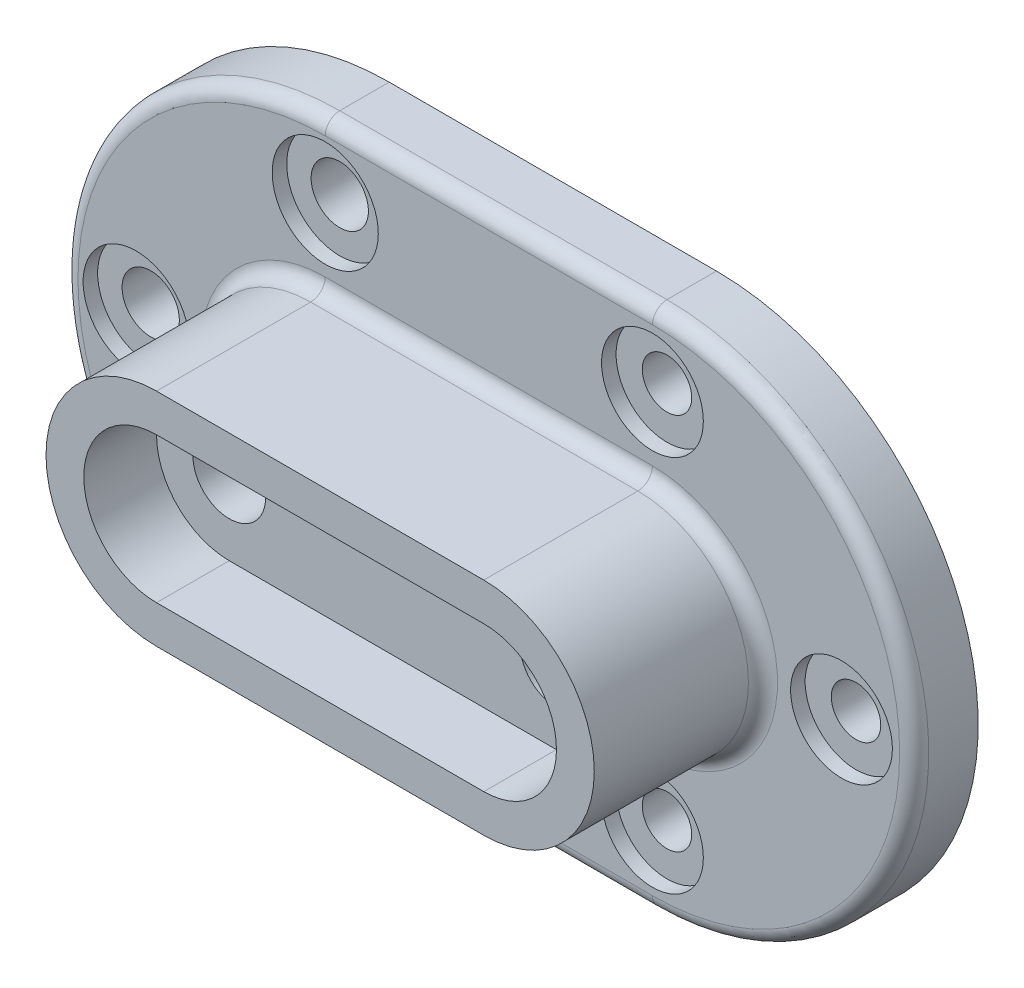
ISO-10303-21;
HEADER;
FILE_DESCRIPTION(('STEP AP214'),'2;1');
FILE_NAME('part.step','',(''),(''),'','','');
FILE_SCHEMA(('AUTOMOTIVE_DESIGN { 1 0 10303 214 1 1 1 1 }'));
ENDSEC;
DATA;
#1=APPLICATION_CONTEXT('core data for automotive mechanical design processes');
#2=APPLICATION_PROTOCOL_DEFINITION('international standard','automotive_design',2000,#1);
#3=PRODUCT_CONTEXT('',#1,'mechanical');
#4=PRODUCT('Part','Part','',(#3));
#5=PRODUCT_RELATED_PRODUCT_CATEGORY('part','',(#4));
#6=PRODUCT_DEFINITION_FORMATION('','',#4);
#7=PRODUCT_DEFINITION_CONTEXT('part definition',#1,'design');
#8=PRODUCT_DEFINITION('design','',#6,#7);
#9=PRODUCT_DEFINITION_SHAPE('','',#8);
#10=(LENGTH_UNIT() NAMED_UNIT(*) SI_UNIT(.MILLI.,.METRE.));
#11=(NAMED_UNIT(*) PLANE_ANGLE_UNIT() SI_UNIT($,.RADIAN.));
#12=(NAMED_UNIT(*) SI_UNIT($,.STERADIAN.) SOLID_ANGLE_UNIT());
#13=UNCERTAINTY_MEASURE_WITH_UNIT(LENGTH_MEASURE(1.E-05),#10,'distance_accuracy_value','');
#14=(GEOMETRIC_REPRESENTATION_CONTEXT(3) GLOBAL_UNCERTAINTY_ASSIGNED_CONTEXT((#13)) GLOBAL_UNIT_ASSIGNED_CONTEXT((#10,
#11,#12)) REPRESENTATION_CONTEXT('',''));
#15=CARTESIAN_POINT('',(0.,0.,0.));
#16=DIRECTION('',(0.,0.,1.));
#17=DIRECTION('',(1.,0.,0.));
#18=AXIS2_PLACEMENT_3D('',#15,#16,#17);
#19=CARTESIAN_POINT('',(0.,18.,4.4));
#20=DIRECTION('',(0.,1.,0.));
#21=DIRECTION('',(0.,0.,1.));
#22=AXIS2_PLACEMENT_3D('',#19,#20,#21);
#23=PLANE('',#22);
#24=DIRECTION('',(0.,0.,-1.));
#25=VECTOR('',#24,1.);
#26=CARTESIAN_POINT('',(0.,18.,4.4));
#27=LINE('',#26,#25);
#28=CARTESIAN_POINT('',(0.,18.,3.4));
#29=VERTEX_POINT('',#28);
#30=CARTESIAN_POINT('',(0.,18.,0.));
#31=VERTEX_POINT('',#30);
#32=EDGE_CURVE('E225',#29,#31,#27,.T.);
#33=ORIENTED_EDGE('',*,*,#32,.F.);
#34=DIRECTION('',(1.,0.,0.));
#35=VECTOR('',#34,1.);
#36=CARTESIAN_POINT('',(0.,18.,3.4));
#37=LINE('',#36,#35);
#38=CARTESIAN_POINT('',(22.5,18.,3.4));
#39=VERTEX_POINT('',#38);
#40=EDGE_CURVE('E261',#29,#39,#37,.T.);
#41=ORIENTED_EDGE('',*,*,#40,.T.);
#42=DIRECTION('',(0.,0.,-1.));
#43=VECTOR('',#42,1.);
#44=CARTESIAN_POINT('',(22.5,18.,4.4));
#45=LINE('',#44,#43);
#46=CARTESIAN_POINT('',(22.5,18.,0.));
#47=VERTEX_POINT('',#46);
#48=EDGE_CURVE('E216',#39,#47,#45,.T.);
#49=ORIENTED_EDGE('',*,*,#48,.T.);
#50=DIRECTION('',(1.,0.,0.));
#51=VECTOR('',#50,1.);
#52=CARTESIAN_POINT('',(0.,18.,0.));
#53=LINE('',#52,#51);
#54=EDGE_CURVE('E199',#31,#47,#53,.T.);
#55=ORIENTED_EDGE('',*,*,#54,.F.);
#56=EDGE_LOOP('',(#33,#41,#49,#55));
#57=FACE_BOUND('',#56,.T.);
#58=ADVANCED_FACE('F43',(#57),#23,.T.);
#59=CARTESIAN_POINT('',(0.,0.,4.4));
#60=DIRECTION('',(0.,0.,-1.));
#61=DIRECTION('',(-1.,0.,0.));
#62=AXIS2_PLACEMENT_3D('',#59,#60,#61);
#63=CYLINDRICAL_SURFACE('',#62,18.);
#64=DIRECTION('',(0.,0.,-1.));
#65=VECTOR('',#64,1.);
#66=CARTESIAN_POINT('',(0.,-18.,4.4));
#67=LINE('',#66,#65);
#68=CARTESIAN_POINT('',(0.,-18.,3.4));
#69=VERTEX_POINT('',#68);
#70=CARTESIAN_POINT('',(0.,-18.,0.));
#71=VERTEX_POINT('',#70);
#72=EDGE_CURVE('E222',#69,#71,#67,.T.);
#73=ORIENTED_EDGE('',*,*,#72,.F.);
#74=CARTESIAN_POINT('',(0.,0.,3.4));
#75=DIRECTION('',(0.,0.,1.));
#76=DIRECTION('',(1.,0.,0.));
#77=AXIS2_PLACEMENT_3D('',#74,#75,#76);
#78=CIRCLE('',#77,18.);
#79=EDGE_CURVE('E258',#69,#29,#78,.F.);
#80=ORIENTED_EDGE('',*,*,#79,.T.);
#81=ORIENTED_EDGE('',*,*,#32,.T.);
#82=CARTESIAN_POINT('',(0.,0.,0.));
#83=DIRECTION('',(0.,0.,1.));
#84=DIRECTION('',(1.,0.,0.));
#85=AXIS2_PLACEMENT_3D('',#82,#83,#84);
#86=CIRCLE('',#85,18.);
#87=EDGE_CURVE('E203',#31,#71,#86,.T.);
#88=ORIENTED_EDGE('',*,*,#87,.T.);
#89=EDGE_LOOP('',(#73,#80,#81,#88));
#90=FACE_BOUND('',#89,.T.);
#91=ADVANCED_FACE('F507',(#90),#63,.T.);
#92=CARTESIAN_POINT('',(0.,-18.,4.4));
#93=DIRECTION('',(0.,1.,0.));
#94=DIRECTION('',(0.,0.,1.));
#95=AXIS2_PLACEMENT_3D('',#92,#93,#94);
#96=PLANE('',#95);
#97=DIRECTION('',(0.,0.,-1.));
#98=VECTOR('',#97,1.);
#99=CARTESIAN_POINT('',(22.5,-18.,4.4));
#100=LINE('',#99,#98);
#101=CARTESIAN_POINT('',(22.5,-18.,3.4));
#102=VERTEX_POINT('',#101);
#103=CARTESIAN_POINT('',(22.5,-18.,0.));
#104=VERTEX_POINT('',#103);
#105=EDGE_CURVE('E219',#102,#104,#100,.T.);
#106=ORIENTED_EDGE('',*,*,#105,.F.);
#107=DIRECTION('',(1.,0.,0.));
#108=VECTOR('',#107,1.);
#109=CARTESIAN_POINT('',(0.,-18.,3.4));
#110=LINE('',#109,#108);
#111=EDGE_CURVE('E254',#102,#69,#110,.F.);
#112=ORIENTED_EDGE('',*,*,#111,.T.);
#113=ORIENTED_EDGE('',*,*,#72,.T.);
#114=DIRECTION('',(1.,0.,0.));
#115=VECTOR('',#114,1.);
#116=CARTESIAN_POINT('',(0.,-18.,0.));
#117=LINE('',#116,#115);
#118=EDGE_CURVE('E208',#71,#104,#117,.T.);
#119=ORIENTED_EDGE('',*,*,#118,.T.);
#120=EDGE_LOOP('',(#106,#112,#113,#119));
#121=FACE_BOUND('',#120,.T.);
#122=ADVANCED_FACE('F513',(#121),#96,.F.);
#123=CARTESIAN_POINT('',(22.5,0.,4.4));
#124=DIRECTION('',(0.,0.,-1.));
#125=DIRECTION('',(-1.,0.,0.));
#126=AXIS2_PLACEMENT_3D('',#123,#124,#125);
#127=CYLINDRICAL_SURFACE('',#126,18.);
#128=ORIENTED_EDGE('',*,*,#48,.F.);
#129=CARTESIAN_POINT('',(22.5,0.,3.4));
#130=DIRECTION('',(0.,0.,1.));
#131=DIRECTION('',(1.,0.,0.));
#132=AXIS2_PLACEMENT_3D('',#129,#130,#131);
#133=CIRCLE('',#132,18.);
#134=EDGE_CURVE('E53',#39,#102,#133,.F.);
#135=ORIENTED_EDGE('',*,*,#134,.T.);
#136=ORIENTED_EDGE('',*,*,#105,.T.);
#137=CARTESIAN_POINT('',(22.5,0.,0.));
#138=DIRECTION('',(0.,0.,1.));
#139=DIRECTION('',(1.,0.,0.));
#140=AXIS2_PLACEMENT_3D('',#137,#138,#139);
#141=CIRCLE('',#140,18.);
#142=EDGE_CURVE('E212',#104,#47,#141,.T.);
#143=ORIENTED_EDGE('',*,*,#142,.T.);
#144=EDGE_LOOP('',(#128,#135,#136,#143));
#145=FACE_BOUND('',#144,.T.);
#146=ADVANCED_FACE('F609',(#145),#127,.T.);
#147=CARTESIAN_POINT('',(0.,0.,4.4));
#148=DIRECTION('',(0.,0.,1.));
#149=DIRECTION('',(1.,0.,0.));
#150=AXIS2_PLACEMENT_3D('',#147,#148,#149);
#151=PLANE('',#150);
#152=CARTESIAN_POINT('',(0.,0.,4.4));
#153=DIRECTION('',(0.,0.,1.));
#154=DIRECTION('',(1.,0.,0.));
#155=AXIS2_PLACEMENT_3D('',#152,#153,#154);
#156=CIRCLE('',#155,17.);
#157=CARTESIAN_POINT('',(0.,17.,4.4));
#158=VERTEX_POINT('',#157);
#159=CARTESIAN_POINT('',(0.,-17.,4.4));
#160=VERTEX_POINT('',#159);
#161=EDGE_CURVE('E247',#158,#160,#156,.T.);
#162=ORIENTED_EDGE('',*,*,#161,.T.);
#163=DIRECTION('',(1.,0.,0.));
#164=VECTOR('',#163,1.);
#165=CARTESIAN_POINT('',(22.5,-17.,4.4));
#166=LINE('',#165,#164);
#167=CARTESIAN_POINT('',(22.5,-17.,4.4));
#168=VERTEX_POINT('',#167);
#169=EDGE_CURVE('E250',#160,#168,#166,.T.);
#170=ORIENTED_EDGE('',*,*,#169,.T.);
#171=CARTESIAN_POINT('',(22.5,0.,4.4));
#172=DIRECTION('',(0.,0.,1.));
#173=DIRECTION('',(1.,0.,0.));
#174=AXIS2_PLACEMENT_3D('',#171,#172,#173);
#175=CIRCLE('',#174,17.);
#176=CARTESIAN_POINT('',(22.5,17.,4.4));
#177=VERTEX_POINT('',#176);
#178=EDGE_CURVE('E241',#168,#177,#175,.T.);
#179=ORIENTED_EDGE('',*,*,#178,.T.);
#180=DIRECTION('',(1.,0.,0.));
#181=VECTOR('',#180,1.);
#182=CARTESIAN_POINT('',(0.,17.,4.4));
#183=LINE('',#182,#181);
#184=EDGE_CURVE('E244',#177,#158,#183,.F.);
#185=ORIENTED_EDGE('',*,*,#184,.T.);
#186=EDGE_LOOP('',(#162,#170,#179,#185));
#187=FACE_BOUND('',#186,.T.);
#188=DIRECTION('',(1.,0.,0.));
#189=VECTOR('',#188,1.);
#190=CARTESIAN_POINT('',(0.,-8.6,4.4));
#191=LINE('',#190,#189);
#192=CARTESIAN_POINT('',(22.5,-8.6,4.4));
#193=VERTEX_POINT('',#192);
#194=CARTESIAN_POINT('',(0.,-8.6,4.4));
#195=VERTEX_POINT('',#194);
#196=EDGE_CURVE('E228',#193,#195,#191,.F.);
#197=ORIENTED_EDGE('',*,*,#196,.T.);
#198=CARTESIAN_POINT('',(0.,0.,4.4));
#199=DIRECTION('',(0.,0.,1.));
#200=DIRECTION('',(1.,0.,0.));
#201=AXIS2_PLACEMENT_3D('',#198,#199,#200);
#202=CIRCLE('',#201,8.6);
#203=CARTESIAN_POINT('',(0.,8.6,4.4));
#204=VERTEX_POINT('',#203);
#205=EDGE_CURVE('E237',#195,#204,#202,.F.);
#206=ORIENTED_EDGE('',*,*,#205,.T.);
#207=DIRECTION('',(1.,0.,0.));
#208=VECTOR('',#207,1.);
#209=CARTESIAN_POINT('',(22.5,8.6,4.4));
#210=LINE('',#209,#208);
#211=CARTESIAN_POINT('',(22.5,8.6,4.4));
#212=VERTEX_POINT('',#211);
#213=EDGE_CURVE('E234',#204,#212,#210,.T.);
#214=ORIENTED_EDGE('',*,*,#213,.T.);
#215=CARTESIAN_POINT('',(22.5,0.,4.4));
#216=DIRECTION('',(0.,0.,1.));
#217=DIRECTION('',(1.,0.,0.));
#218=AXIS2_PLACEMENT_3D('',#215,#216,#217);
#219=CIRCLE('',#218,8.6);
#220=EDGE_CURVE('E231',#212,#193,#219,.F.);
#221=ORIENTED_EDGE('',*,*,#220,.T.);
#222=EDGE_LOOP('',(#197,#206,#214,#221));
#223=FACE_BOUND('',#222,.T.);
#224=CARTESIAN_POINT('',(35.5,0.,4.4));
#225=DIRECTION('',(0.,0.,1.));
#226=DIRECTION('',(1.,0.,0.));
#227=AXIS2_PLACEMENT_3D('',#224,#225,#226);
#228=CIRCLE('',#227,3.50000000000001);
#229=CARTESIAN_POINT('',(39.,0.,4.4));
#230=VERTEX_POINT('',#229);
#231=EDGE_CURVE('E425',#230,#230,#228,.T.);
#232=ORIENTED_EDGE('',*,*,#231,.F.);
#233=EDGE_LOOP('',(#232));
#234=FACE_BOUND('',#233,.T.);
#235=CARTESIAN_POINT('',(-1.37759813053774E-13,-13.,4.4));
#236=DIRECTION('',(0.,0.,1.));
#237=DIRECTION('',(1.,0.,0.));
#238=AXIS2_PLACEMENT_3D('',#235,#236,#237);
#239=CIRCLE('',#238,3.64892559210427);
#240=CARTESIAN_POINT('',(3.64892559210413,-13.,4.4));
#241=VERTEX_POINT('',#240);
#242=EDGE_CURVE('E426',#241,#241,#239,.T.);
#243=ORIENTED_EDGE('',*,*,#242,.F.);
#244=EDGE_LOOP('',(#243));
#245=FACE_BOUND('',#244,.T.);
#246=CARTESIAN_POINT('',(22.5000000000001,13.,4.4));
#247=DIRECTION('',(0.,0.,1.));
#248=DIRECTION('',(1.,0.,0.));
#249=AXIS2_PLACEMENT_3D('',#246,#247,#248);
#250=CIRCLE('',#249,3.50000000000001);
#251=CARTESIAN_POINT('',(26.0000000000001,13.,4.4));
#252=VERTEX_POINT('',#251);
#253=EDGE_CURVE('E392',#252,#252,#250,.T.);
#254=ORIENTED_EDGE('',*,*,#253,.F.);
#255=EDGE_LOOP('',(#254));
#256=FACE_BOUND('',#255,.T.);
#257=CARTESIAN_POINT('',(0.,13.,4.4));
#258=DIRECTION('',(0.,0.,1.));
#259=DIRECTION('',(1.,0.,0.));
#260=AXIS2_PLACEMENT_3D('',#257,#258,#259);
#261=CIRCLE('',#260,3.64892559210427);
#262=CARTESIAN_POINT('',(3.64892559210431,13.,4.4));
#263=VERTEX_POINT('',#262);
#264=EDGE_CURVE('E401',#263,#263,#261,.T.);
#265=ORIENTED_EDGE('',*,*,#264,.F.);
#266=EDGE_LOOP('',(#265));
#267=FACE_BOUND('',#266,.T.);
#268=CARTESIAN_POINT('',(22.5,-13.,4.4));
#269=DIRECTION('',(0.,0.,1.));
#270=DIRECTION('',(1.,0.,0.));
#271=AXIS2_PLACEMENT_3D('',#268,#269,#270);
#272=CIRCLE('',#271,3.50000000000001);
#273=CARTESIAN_POINT('',(26.,-13.,4.4));
#274=VERTEX_POINT('',#273);
#275=EDGE_CURVE('E409',#274,#274,#272,.T.);
#276=ORIENTED_EDGE('',*,*,#275,.F.);
#277=EDGE_LOOP('',(#276));
#278=FACE_BOUND('',#277,.T.);
#279=CARTESIAN_POINT('',(-13.,0.,4.4));
#280=DIRECTION('',(0.,0.,1.));
#281=DIRECTION('',(1.,0.,0.));
#282=AXIS2_PLACEMENT_3D('',#279,#280,#281);
#283=CIRCLE('',#282,3.64892559210427);
#284=CARTESIAN_POINT('',(-9.35107440789573,0.,4.4));
#285=VERTEX_POINT('',#284);
#286=EDGE_CURVE('E417',#285,#285,#283,.T.);
#287=ORIENTED_EDGE('',*,*,#286,.F.);
#288=EDGE_LOOP('',(#287));
#289=FACE_BOUND('',#288,.T.);
#290=ADVANCED_FACE('F312',(#187,#223,#234,#245,#256,#267,#278,#289),#151,.T.);
#291=CARTESIAN_POINT('',(0.,0.,0.));
#292=DIRECTION('',(0.,0.,1.));
#293=DIRECTION('',(1.,0.,0.));
#294=AXIS2_PLACEMENT_3D('',#291,#292,#293);
#295=PLANE('',#294);
#296=CARTESIAN_POINT('',(-13.,0.,0.));
#297=DIRECTION('',(0.,0.,1.));
#298=DIRECTION('',(1.,0.,0.));
#299=AXIS2_PLACEMENT_3D('',#296,#297,#298);
#300=CIRCLE('',#299,1.97040033987221);
#301=CARTESIAN_POINT('',(-11.0295996601278,0.,0.));
#302=VERTEX_POINT('',#301);
#303=EDGE_CURVE('E463',#302,#302,#300,.T.);
#304=ORIENTED_EDGE('',*,*,#303,.T.);
#305=EDGE_LOOP('',(#304));
#306=FACE_BOUND('',#305,.T.);
#307=CARTESIAN_POINT('',(22.5,-13.,0.));
#308=DIRECTION('',(0.,0.,1.));
#309=DIRECTION('',(1.,0.,0.));
#310=AXIS2_PLACEMENT_3D('',#307,#308,#309);
#311=CIRCLE('',#310,1.7);
#312=CARTESIAN_POINT('',(24.1999999999999,-13.,0.));
#313=VERTEX_POINT('',#312);
#314=EDGE_CURVE('E289',#313,#313,#311,.T.);
#315=ORIENTED_EDGE('',*,*,#314,.T.);
#316=EDGE_LOOP('',(#315));
#317=FACE_BOUND('',#316,.T.);
#318=CARTESIAN_POINT('',(22.5000000000001,13.,0.));
#319=DIRECTION('',(0.,0.,1.));
#320=DIRECTION('',(1.,0.,0.));
#321=AXIS2_PLACEMENT_3D('',#318,#319,#320);
#322=CIRCLE('',#321,1.7);
#323=CARTESIAN_POINT('',(24.2000000000001,13.,0.));
#324=VERTEX_POINT('',#323);
#325=EDGE_CURVE('E464',#324,#324,#322,.T.);
#326=ORIENTED_EDGE('',*,*,#325,.T.);
#327=EDGE_LOOP('',(#326));
#328=FACE_BOUND('',#327,.T.);
#329=CARTESIAN_POINT('',(35.5,0.,0.));
#330=DIRECTION('',(0.,0.,1.));
#331=DIRECTION('',(1.,0.,0.));
#332=AXIS2_PLACEMENT_3D('',#329,#330,#331);
#333=CIRCLE('',#332,1.7);
#334=CARTESIAN_POINT('',(37.2,0.,0.));
#335=VERTEX_POINT('',#334);
#336=EDGE_CURVE('E468',#335,#335,#333,.T.);
#337=ORIENTED_EDGE('',*,*,#336,.T.);
#338=EDGE_LOOP('',(#337));
#339=FACE_BOUND('',#338,.T.);
#340=CARTESIAN_POINT('',(-1.37759813053774E-13,-13.,0.));
#341=DIRECTION('',(0.,0.,1.));
#342=DIRECTION('',(1.,0.,0.));
#343=AXIS2_PLACEMENT_3D('',#340,#341,#342);
#344=CIRCLE('',#343,1.97040033987221);
#345=CARTESIAN_POINT('',(1.97040033987207,-13.,0.));
#346=VERTEX_POINT('',#345);
#347=EDGE_CURVE('E472',#346,#346,#344,.T.);
#348=ORIENTED_EDGE('',*,*,#347,.T.);
#349=EDGE_LOOP('',(#348));
#350=FACE_BOUND('',#349,.T.);
#351=CARTESIAN_POINT('',(0.,13.,0.));
#352=DIRECTION('',(0.,0.,1.));
#353=DIRECTION('',(1.,0.,0.));
#354=AXIS2_PLACEMENT_3D('',#351,#352,#353);
#355=CIRCLE('',#354,1.97040033987221);
#356=CARTESIAN_POINT('',(1.97040033987226,13.,0.));
#357=VERTEX_POINT('',#356);
#358=EDGE_CURVE('E476',#357,#357,#355,.T.);
#359=ORIENTED_EDGE('',*,*,#358,.T.);
#360=EDGE_LOOP('',(#359));
#361=FACE_BOUND('',#360,.T.);
#362=CARTESIAN_POINT('',(0.,0.,0.));
#363=DIRECTION('',(0.,0.,1.));
#364=DIRECTION('',(1.,0.,0.));
#365=AXIS2_PLACEMENT_3D('',#362,#363,#364);
#366=CIRCLE('',#365,2.5);
#367=CARTESIAN_POINT('',(2.5,0.,0.));
#368=VERTEX_POINT('',#367);
#369=EDGE_CURVE('E170',#368,#368,#366,.T.);
#370=ORIENTED_EDGE('',*,*,#369,.T.);
#371=EDGE_LOOP('',(#370));
#372=FACE_BOUND('',#371,.T.);
#373=CARTESIAN_POINT('',(22.5,0.,0.));
#374=DIRECTION('',(0.,0.,1.));
#375=DIRECTION('',(1.,0.,0.));
#376=AXIS2_PLACEMENT_3D('',#373,#374,#375);
#377=CIRCLE('',#376,2.5);
#378=CARTESIAN_POINT('',(25.,0.,0.));
#379=VERTEX_POINT('',#378);
#380=EDGE_CURVE('E380',#379,#379,#377,.T.);
#381=ORIENTED_EDGE('',*,*,#380,.T.);
#382=EDGE_LOOP('',(#381));
#383=FACE_BOUND('',#382,.T.);
#384=ORIENTED_EDGE('',*,*,#54,.T.);
#385=ORIENTED_EDGE('',*,*,#142,.F.);
#386=ORIENTED_EDGE('',*,*,#118,.F.);
#387=ORIENTED_EDGE('',*,*,#87,.F.);
#388=EDGE_LOOP('',(#384,#385,#386,#387));
#389=FACE_BOUND('',#388,.T.);
#390=ADVANCED_FACE('F487',(#306,#317,#328,#339,#350,#361,#372,#383,#389),#295,.F.);
#391=CARTESIAN_POINT('',(0.,-7.6,16.));
#392=DIRECTION('',(0.,1.,0.));
#393=DIRECTION('',(0.,0.,1.));
#394=AXIS2_PLACEMENT_3D('',#391,#392,#393);
#395=PLANE('',#394);
#396=DIRECTION('',(0.,0.,-1.));
#397=VECTOR('',#396,1.);
#398=CARTESIAN_POINT('',(0.,-7.6,16.));
#399=LINE('',#398,#397);
#400=CARTESIAN_POINT('',(0.,-7.6,16.));
#401=VERTEX_POINT('',#400);
#402=CARTESIAN_POINT('',(0.,-7.6,5.4));
#403=VERTEX_POINT('',#402);
#404=EDGE_CURVE('E188',#401,#403,#399,.T.);
#405=ORIENTED_EDGE('',*,*,#404,.T.);
#406=DIRECTION('',(1.,0.,0.));
#407=VECTOR('',#406,1.);
#408=CARTESIAN_POINT('',(0.,-7.6,5.4));
#409=LINE('',#408,#407);
#410=CARTESIAN_POINT('',(22.5,-7.6,5.4));
#411=VERTEX_POINT('',#410);
#412=EDGE_CURVE('E11',#403,#411,#409,.T.);
#413=ORIENTED_EDGE('',*,*,#412,.T.);
#414=DIRECTION('',(0.,0.,-1.));
#415=VECTOR('',#414,1.);
#416=CARTESIAN_POINT('',(22.5,-7.6,16.));
#417=LINE('',#416,#415);
#418=CARTESIAN_POINT('',(22.5,-7.6,16.));
#419=VERTEX_POINT('',#418);
#420=EDGE_CURVE('E204',#419,#411,#417,.T.);
#421=ORIENTED_EDGE('',*,*,#420,.F.);
#422=DIRECTION('',(1.,0.,0.));
#423=VECTOR('',#422,1.);
#424=CARTESIAN_POINT('',(0.,-7.6,16.));
#425=LINE('',#424,#423);
#426=EDGE_CURVE('E328',#401,#419,#425,.T.);
#427=ORIENTED_EDGE('',*,*,#426,.F.);
#428=EDGE_LOOP('',(#405,#413,#421,#427));
#429=FACE_BOUND('',#428,.T.);
#430=ADVANCED_FACE('F326',(#429),#395,.F.);
#431=CARTESIAN_POINT('',(22.5,0.,16.));
#432=DIRECTION('',(0.,0.,-1.));
#433=DIRECTION('',(-1.,0.,0.));
#434=AXIS2_PLACEMENT_3D('',#431,#432,#433);
#435=CYLINDRICAL_SURFACE('',#434,7.6);
#436=ORIENTED_EDGE('',*,*,#420,.T.);
#437=CARTESIAN_POINT('',(22.5,0.,5.4));
#438=DIRECTION('',(0.,0.,1.));
#439=DIRECTION('',(1.,0.,0.));
#440=AXIS2_PLACEMENT_3D('',#437,#438,#439);
#441=CIRCLE('',#440,7.6);
#442=CARTESIAN_POINT('',(22.5,7.6,5.4));
#443=VERTEX_POINT('',#442);
#444=EDGE_CURVE('E66',#411,#443,#441,.T.);
#445=ORIENTED_EDGE('',*,*,#444,.T.);
#446=DIRECTION('',(0.,0.,-1.));
#447=VECTOR('',#446,1.);
#448=CARTESIAN_POINT('',(22.5,7.6,16.));
#449=LINE('',#448,#447);
#450=CARTESIAN_POINT('',(22.5,7.6,16.));
#451=VERTEX_POINT('',#450);
#452=EDGE_CURVE('E350',#451,#443,#449,.T.);
#453=ORIENTED_EDGE('',*,*,#452,.F.);
#454=CARTESIAN_POINT('',(22.5,0.,16.));
#455=DIRECTION('',(0.,0.,1.));
#456=DIRECTION('',(1.,0.,0.));
#457=AXIS2_PLACEMENT_3D('',#454,#455,#456);
#458=CIRCLE('',#457,7.6);
#459=EDGE_CURVE('E331',#419,#451,#458,.T.);
#460=ORIENTED_EDGE('',*,*,#459,.F.);
#461=EDGE_LOOP('',(#436,#445,#453,#460));
#462=FACE_BOUND('',#461,.T.);
#463=ADVANCED_FACE('F579',(#462),#435,.T.);
#464=CARTESIAN_POINT('',(0.,7.6,16.));
#465=DIRECTION('',(0.,1.,0.));
#466=DIRECTION('',(-1.,0.,0.));
#467=AXIS2_PLACEMENT_3D('',#464,#465,#466);
#468=PLANE('',#467);
#469=ORIENTED_EDGE('',*,*,#452,.T.);
#470=DIRECTION('',(1.,0.,0.));
#471=VECTOR('',#470,1.);
#472=CARTESIAN_POINT('',(0.,7.6,5.4));
#473=LINE('',#472,#471);
#474=CARTESIAN_POINT('',(0.,7.6,5.4));
#475=VERTEX_POINT('',#474);
#476=EDGE_CURVE('E268',#443,#475,#473,.F.);
#477=ORIENTED_EDGE('',*,*,#476,.T.);
#478=DIRECTION('',(0.,0.,-1.));
#479=VECTOR('',#478,1.);
#480=CARTESIAN_POINT('',(0.,7.6,16.));
#481=LINE('',#480,#479);
#482=CARTESIAN_POINT('',(0.,7.6,16.));
#483=VERTEX_POINT('',#482);
#484=EDGE_CURVE('E193',#483,#475,#481,.T.);
#485=ORIENTED_EDGE('',*,*,#484,.F.);
#486=DIRECTION('',(1.,0.,0.));
#487=VECTOR('',#486,1.);
#488=CARTESIAN_POINT('',(0.,7.6,16.));
#489=LINE('',#488,#487);
#490=EDGE_CURVE('E336',#483,#451,#489,.T.);
#491=ORIENTED_EDGE('',*,*,#490,.T.);
#492=EDGE_LOOP('',(#469,#477,#485,#491));
#493=FACE_BOUND('',#492,.T.);
#494=ADVANCED_FACE('F574',(#493),#468,.T.);
#495=CARTESIAN_POINT('',(22.5,0.,16.));
#496=DIRECTION('',(0.,0.,-1.));
#497=DIRECTION('',(-1.,0.,0.));
#498=AXIS2_PLACEMENT_3D('',#495,#496,#497);
#499=CYLINDRICAL_SURFACE('',#498,5.);
#500=CARTESIAN_POINT('',(22.5,0.,11.));
#501=DIRECTION('',(0.,0.,1.));
#502=DIRECTION('',(1.,0.,0.));
#503=AXIS2_PLACEMENT_3D('',#500,#501,#502);
#504=CIRCLE('',#503,5.);
#505=CARTESIAN_POINT('',(22.5,-5.,11.));
#506=VERTEX_POINT('',#505);
#507=CARTESIAN_POINT('',(22.5,5.,11.));
#508=VERTEX_POINT('',#507);
#509=EDGE_CURVE('E162',#506,#508,#504,.T.);
#510=ORIENTED_EDGE('',*,*,#509,.F.);
#511=DIRECTION('',(0.,0.,-1.));
#512=VECTOR('',#511,1.);
#513=CARTESIAN_POINT('',(22.5,-5.,16.));
#514=LINE('',#513,#512);
#515=CARTESIAN_POINT('',(22.5,-5.,16.));
#516=VERTEX_POINT('',#515);
#517=EDGE_CURVE('E176',#516,#506,#514,.T.);
#518=ORIENTED_EDGE('',*,*,#517,.F.);
#519=CARTESIAN_POINT('',(22.5,0.,16.));
#520=DIRECTION('',(0.,0.,1.));
#521=DIRECTION('',(1.,0.,0.));
#522=AXIS2_PLACEMENT_3D('',#519,#520,#521);
#523=CIRCLE('',#522,5.);
#524=CARTESIAN_POINT('',(22.5,5.,16.));
#525=VERTEX_POINT('',#524);
#526=EDGE_CURVE('E366',#516,#525,#523,.T.);
#527=ORIENTED_EDGE('',*,*,#526,.T.);
#528=DIRECTION('',(0.,0.,-1.));
#529=VECTOR('',#528,1.);
#530=CARTESIAN_POINT('',(22.5,5.,16.));
#531=LINE('',#530,#529);
#532=EDGE_CURVE('E179',#525,#508,#531,.T.);
#533=ORIENTED_EDGE('',*,*,#532,.T.);
#534=EDGE_LOOP('',(#510,#518,#527,#533));
#535=FACE_BOUND('',#534,.T.);
#536=ADVANCED_FACE('F174',(#535),#499,.F.);
#537=CARTESIAN_POINT('',(0.,-5.,16.));
#538=DIRECTION('',(0.,1.,0.));
#539=DIRECTION('',(0.,0.,1.));
#540=AXIS2_PLACEMENT_3D('',#537,#538,#539);
#541=PLANE('',#540);
#542=DIRECTION('',(1.,0.,0.));
#543=VECTOR('',#542,1.);
#544=CARTESIAN_POINT('',(0.,-5.,11.));
#545=LINE('',#544,#543);
#546=CARTESIAN_POINT('',(0.,-5.,11.));
#547=VERTEX_POINT('',#546);
#548=EDGE_CURVE('E159',#547,#506,#545,.T.);
#549=ORIENTED_EDGE('',*,*,#548,.F.);
#550=DIRECTION('',(0.,0.,-1.));
#551=VECTOR('',#550,1.);
#552=CARTESIAN_POINT('',(0.,-5.,16.));
#553=LINE('',#552,#551);
#554=CARTESIAN_POINT('',(0.,-5.,16.));
#555=VERTEX_POINT('',#554);
#556=EDGE_CURVE('E189',#555,#547,#553,.T.);
#557=ORIENTED_EDGE('',*,*,#556,.F.);
#558=DIRECTION('',(1.,0.,0.));
#559=VECTOR('',#558,1.);
#560=CARTESIAN_POINT('',(0.,-5.,16.));
#561=LINE('',#560,#559);
#562=EDGE_CURVE('E186',#555,#516,#561,.T.);
#563=ORIENTED_EDGE('',*,*,#562,.T.);
#564=ORIENTED_EDGE('',*,*,#517,.T.);
#565=EDGE_LOOP('',(#549,#557,#563,#564));
#566=FACE_BOUND('',#565,.T.);
#567=ADVANCED_FACE('F184',(#566),#541,.T.);
#568=CARTESIAN_POINT('',(0.,0.,16.));
#569=DIRECTION('',(0.,0.,-1.));
#570=DIRECTION('',(-1.,0.,0.));
#571=AXIS2_PLACEMENT_3D('',#568,#569,#570);
#572=CYLINDRICAL_SURFACE('',#571,5.);
#573=CARTESIAN_POINT('',(0.,0.,11.));
#574=DIRECTION('',(0.,0.,1.));
#575=DIRECTION('',(1.,0.,0.));
#576=AXIS2_PLACEMENT_3D('',#573,#574,#575);
#577=CIRCLE('',#576,5.);
#578=CARTESIAN_POINT('',(0.,5.,11.));
#579=VERTEX_POINT('',#578);
#580=EDGE_CURVE('E165',#579,#547,#577,.T.);
#581=ORIENTED_EDGE('',*,*,#580,.F.);
#582=DIRECTION('',(0.,0.,-1.));
#583=VECTOR('',#582,1.);
#584=CARTESIAN_POINT('',(0.,5.,16.));
#585=LINE('',#584,#583);
#586=CARTESIAN_POINT('',(0.,5.,16.));
#587=VERTEX_POINT('',#586);
#588=EDGE_CURVE('E195',#587,#579,#585,.T.);
#589=ORIENTED_EDGE('',*,*,#588,.F.);
#590=CARTESIAN_POINT('',(0.,0.,16.));
#591=DIRECTION('',(0.,0.,1.));
#592=DIRECTION('',(1.,0.,0.));
#593=AXIS2_PLACEMENT_3D('',#590,#591,#592);
#594=CIRCLE('',#593,5.);
#595=EDGE_CURVE('E338',#587,#555,#594,.T.);
#596=ORIENTED_EDGE('',*,*,#595,.T.);
#597=ORIENTED_EDGE('',*,*,#556,.T.);
#598=EDGE_LOOP('',(#581,#589,#596,#597));
#599=FACE_BOUND('',#598,.T.);
#600=ADVANCED_FACE('F364',(#599),#572,.F.);
#601=CARTESIAN_POINT('',(0.,5.,16.));
#602=DIRECTION('',(0.,1.,0.));
#603=DIRECTION('',(-1.,0.,0.));
#604=AXIS2_PLACEMENT_3D('',#601,#602,#603);
#605=PLANE('',#604);
#606=ORIENTED_EDGE('',*,*,#588,.T.);
#607=DIRECTION('',(1.,0.,0.));
#608=VECTOR('',#607,1.);
#609=CARTESIAN_POINT('',(0.,5.,11.));
#610=LINE('',#609,#608);
#611=EDGE_CURVE('E181',#579,#508,#610,.T.);
#612=ORIENTED_EDGE('',*,*,#611,.T.);
#613=ORIENTED_EDGE('',*,*,#532,.F.);
#614=DIRECTION('',(1.,0.,0.));
#615=VECTOR('',#614,1.);
#616=CARTESIAN_POINT('',(0.,5.,16.));
#617=LINE('',#616,#615);
#618=EDGE_CURVE('E332',#587,#525,#617,.T.);
#619=ORIENTED_EDGE('',*,*,#618,.F.);
#620=EDGE_LOOP('',(#606,#612,#613,#619));
#621=FACE_BOUND('',#620,.T.);
#622=ADVANCED_FACE('F360',(#621),#605,.F.);
#623=CARTESIAN_POINT('',(0.,0.,16.));
#624=DIRECTION('',(0.,0.,-1.));
#625=DIRECTION('',(-1.,0.,0.));
#626=AXIS2_PLACEMENT_3D('',#623,#624,#625);
#627=CYLINDRICAL_SURFACE('',#626,7.6);
#628=ORIENTED_EDGE('',*,*,#484,.T.);
#629=CARTESIAN_POINT('',(0.,0.,5.4));
#630=DIRECTION('',(0.,0.,1.));
#631=DIRECTION('',(1.,0.,0.));
#632=AXIS2_PLACEMENT_3D('',#629,#630,#631);
#633=CIRCLE('',#632,7.6);
#634=EDGE_CURVE('E264',#475,#403,#633,.T.);
#635=ORIENTED_EDGE('',*,*,#634,.T.);
#636=ORIENTED_EDGE('',*,*,#404,.F.);
#637=CARTESIAN_POINT('',(0.,0.,16.));
#638=DIRECTION('',(0.,0.,1.));
#639=DIRECTION('',(1.,0.,0.));
#640=AXIS2_PLACEMENT_3D('',#637,#638,#639);
#641=CIRCLE('',#640,7.6);
#642=EDGE_CURVE('E345',#483,#401,#641,.T.);
#643=ORIENTED_EDGE('',*,*,#642,.F.);
#644=EDGE_LOOP('',(#628,#635,#636,#643));
#645=FACE_BOUND('',#644,.T.);
#646=ADVANCED_FACE('F323',(#645),#627,.T.);
#647=CARTESIAN_POINT('',(0.,0.,16.));
#648=DIRECTION('',(0.,0.,1.));
#649=DIRECTION('',(1.,0.,0.));
#650=AXIS2_PLACEMENT_3D('',#647,#648,#649);
#651=PLANE('',#650);
#652=ORIENTED_EDGE('',*,*,#526,.F.);
#653=ORIENTED_EDGE('',*,*,#562,.F.);
#654=ORIENTED_EDGE('',*,*,#595,.F.);
#655=ORIENTED_EDGE('',*,*,#618,.T.);
#656=EDGE_LOOP('',(#652,#653,#654,#655));
#657=FACE_BOUND('',#656,.T.);
#658=ORIENTED_EDGE('',*,*,#426,.T.);
#659=ORIENTED_EDGE('',*,*,#459,.T.);
#660=ORIENTED_EDGE('',*,*,#490,.F.);
#661=ORIENTED_EDGE('',*,*,#642,.T.);
#662=EDGE_LOOP('',(#658,#659,#660,#661));
#663=FACE_BOUND('',#662,.T.);
#664=ADVANCED_FACE('F565',(#657,#663),#651,.T.);
#665=CARTESIAN_POINT('',(0.,0.,11.));
#666=DIRECTION('',(0.,0.,1.));
#667=DIRECTION('',(1.,0.,0.));
#668=AXIS2_PLACEMENT_3D('',#665,#666,#667);
#669=PLANE('',#668);
#670=CARTESIAN_POINT('',(0.,0.,11.));
#671=DIRECTION('',(0.,0.,1.));
#672=DIRECTION('',(1.,0.,0.));
#673=AXIS2_PLACEMENT_3D('',#670,#671,#672);
#674=CIRCLE('',#673,2.5);
#675=CARTESIAN_POINT('',(2.5,0.,11.));
#676=VERTEX_POINT('',#675);
#677=EDGE_CURVE('E385',#676,#676,#674,.T.);
#678=ORIENTED_EDGE('',*,*,#677,.F.);
#679=EDGE_LOOP('',(#678));
#680=FACE_BOUND('',#679,.T.);
#681=CARTESIAN_POINT('',(22.5,0.,11.));
#682=DIRECTION('',(0.,0.,1.));
#683=DIRECTION('',(1.,0.,0.));
#684=AXIS2_PLACEMENT_3D('',#681,#682,#683);
#685=CIRCLE('',#684,2.5);
#686=CARTESIAN_POINT('',(25.,0.,11.));
#687=VERTEX_POINT('',#686);
#688=EDGE_CURVE('E376',#687,#687,#685,.T.);
#689=ORIENTED_EDGE('',*,*,#688,.F.);
#690=EDGE_LOOP('',(#689));
#691=FACE_BOUND('',#690,.T.);
#692=ORIENTED_EDGE('',*,*,#548,.T.);
#693=ORIENTED_EDGE('',*,*,#509,.T.);
#694=ORIENTED_EDGE('',*,*,#611,.F.);
#695=ORIENTED_EDGE('',*,*,#580,.T.);
#696=EDGE_LOOP('',(#692,#693,#694,#695));
#697=FACE_BOUND('',#696,.T.);
#698=ADVANCED_FACE('F161',(#680,#691,#697),#669,.T.);
#699=CARTESIAN_POINT('',(22.5,0.,0.));
#700=DIRECTION('',(0.,0.,1.));
#701=DIRECTION('',(1.,0.,0.));
#702=AXIS2_PLACEMENT_3D('',#699,#700,#701);
#703=CYLINDRICAL_SURFACE('',#702,2.5);
#704=ORIENTED_EDGE('',*,*,#380,.F.);
#705=EDGE_LOOP('',(#704));
#706=FACE_BOUND('',#705,.T.);
#707=ORIENTED_EDGE('',*,*,#688,.T.);
#708=EDGE_LOOP('',(#707));
#709=FACE_BOUND('',#708,.T.);
#710=ADVANCED_FACE('F824',(#706,#709),#703,.F.);
#711=CARTESIAN_POINT('',(0.,0.,0.));
#712=DIRECTION('',(0.,0.,1.));
#713=DIRECTION('',(1.,0.,0.));
#714=AXIS2_PLACEMENT_3D('',#711,#712,#713);
#715=CYLINDRICAL_SURFACE('',#714,2.5);
#716=ORIENTED_EDGE('',*,*,#369,.F.);
#717=EDGE_LOOP('',(#716));
#718=FACE_BOUND('',#717,.T.);
#719=ORIENTED_EDGE('',*,*,#677,.T.);
#720=EDGE_LOOP('',(#719));
#721=FACE_BOUND('',#720,.T.);
#722=ADVANCED_FACE('F814',(#718,#721),#715,.F.);
#723=CARTESIAN_POINT('',(-13.,0.,3.4));
#724=DIRECTION('',(0.,0.,1.));
#725=DIRECTION('',(1.,0.,0.));
#726=AXIS2_PLACEMENT_3D('',#723,#724,#725);
#727=CYLINDRICAL_SURFACE('',#726,3.64892559210427);
#728=CARTESIAN_POINT('',(-13.,0.,3.4));
#729=DIRECTION('',(0.,0.,1.));
#730=DIRECTION('',(1.,0.,0.));
#731=AXIS2_PLACEMENT_3D('',#728,#729,#730);
#732=CIRCLE('',#731,3.64892559210427);
#733=CARTESIAN_POINT('',(-9.35107440789573,0.,3.4));
#734=VERTEX_POINT('',#733);
#735=EDGE_CURVE('E421',#734,#734,#732,.T.);
#736=ORIENTED_EDGE('',*,*,#735,.F.);
#737=EDGE_LOOP('',(#736));
#738=FACE_BOUND('',#737,.T.);
#739=ORIENTED_EDGE('',*,*,#286,.T.);
#740=EDGE_LOOP('',(#739));
#741=FACE_BOUND('',#740,.T.);
#742=ADVANCED_FACE('F804',(#738,#741),#727,.F.);
#743=CARTESIAN_POINT('',(-13.,0.,3.4));
#744=DIRECTION('',(0.,0.,1.));
#745=DIRECTION('',(1.,0.,0.));
#746=AXIS2_PLACEMENT_3D('',#743,#744,#745);
#747=PLANE('',#746);
#748=CARTESIAN_POINT('',(-13.,0.,3.4));
#749=DIRECTION('',(0.,0.,1.));
#750=DIRECTION('',(1.,0.,0.));
#751=AXIS2_PLACEMENT_3D('',#748,#749,#750);
#752=CIRCLE('',#751,1.97040033987221);
#753=CARTESIAN_POINT('',(-11.0295996601278,0.,3.4));
#754=VERTEX_POINT('',#753);
#755=EDGE_CURVE('E430',#754,#754,#752,.T.);
#756=ORIENTED_EDGE('',*,*,#755,.F.);
#757=EDGE_LOOP('',(#756));
#758=FACE_BOUND('',#757,.T.);
#759=ORIENTED_EDGE('',*,*,#735,.T.);
#760=EDGE_LOOP('',(#759));
#761=FACE_BOUND('',#760,.T.);
#762=ADVANCED_FACE('F794',(#758,#761),#747,.T.);
#763=CARTESIAN_POINT('',(22.5,-13.,3.4));
#764=DIRECTION('',(0.,0.,1.));
#765=DIRECTION('',(1.,0.,0.));
#766=AXIS2_PLACEMENT_3D('',#763,#764,#765);
#767=CYLINDRICAL_SURFACE('',#766,3.50000000000001);
#768=CARTESIAN_POINT('',(22.5,-13.,3.4));
#769=DIRECTION('',(0.,0.,1.));
#770=DIRECTION('',(1.,0.,0.));
#771=AXIS2_PLACEMENT_3D('',#768,#769,#770);
#772=CIRCLE('',#771,3.50000000000001);
#773=CARTESIAN_POINT('',(26.,-13.,3.4));
#774=VERTEX_POINT('',#773);
#775=EDGE_CURVE('E413',#774,#774,#772,.T.);
#776=ORIENTED_EDGE('',*,*,#775,.F.);
#777=EDGE_LOOP('',(#776));
#778=FACE_BOUND('',#777,.T.);
#779=ORIENTED_EDGE('',*,*,#275,.T.);
#780=EDGE_LOOP('',(#779));
#781=FACE_BOUND('',#780,.T.);
#782=ADVANCED_FACE('F784',(#778,#781),#767,.F.);
#783=CARTESIAN_POINT('',(22.5,-13.,3.4));
#784=DIRECTION('',(0.,0.,1.));
#785=DIRECTION('',(1.,0.,0.));
#786=AXIS2_PLACEMENT_3D('',#783,#784,#785);
#787=PLANE('',#786);
#788=CARTESIAN_POINT('',(22.5,-13.,3.4));
#789=DIRECTION('',(0.,0.,1.));
#790=DIRECTION('',(1.,0.,0.));
#791=AXIS2_PLACEMENT_3D('',#788,#789,#790);
#792=CIRCLE('',#791,1.7);
#793=CARTESIAN_POINT('',(24.1999999999999,-13.,3.4));
#794=VERTEX_POINT('',#793);
#795=EDGE_CURVE('E443',#794,#794,#792,.T.);
#796=ORIENTED_EDGE('',*,*,#795,.F.);
#797=EDGE_LOOP('',(#796));
#798=FACE_BOUND('',#797,.T.);
#799=ORIENTED_EDGE('',*,*,#775,.T.);
#800=EDGE_LOOP('',(#799));
#801=FACE_BOUND('',#800,.T.);
#802=ADVANCED_FACE('F774',(#798,#801),#787,.T.);
#803=CARTESIAN_POINT('',(0.,13.,3.4));
#804=DIRECTION('',(0.,0.,1.));
#805=DIRECTION('',(1.,0.,0.));
#806=AXIS2_PLACEMENT_3D('',#803,#804,#805);
#807=CYLINDRICAL_SURFACE('',#806,3.64892559210427);
#808=CARTESIAN_POINT('',(0.,13.,3.4));
#809=DIRECTION('',(0.,0.,1.));
#810=DIRECTION('',(1.,0.,0.));
#811=AXIS2_PLACEMENT_3D('',#808,#809,#810);
#812=CIRCLE('',#811,3.64892559210427);
#813=CARTESIAN_POINT('',(3.64892559210431,13.,3.4));
#814=VERTEX_POINT('',#813);
#815=EDGE_CURVE('E405',#814,#814,#812,.T.);
#816=ORIENTED_EDGE('',*,*,#815,.F.);
#817=EDGE_LOOP('',(#816));
#818=FACE_BOUND('',#817,.T.);
#819=ORIENTED_EDGE('',*,*,#264,.T.);
#820=EDGE_LOOP('',(#819));
#821=FACE_BOUND('',#820,.T.);
#822=ADVANCED_FACE('F764',(#818,#821),#807,.F.);
#823=CARTESIAN_POINT('',(0.,13.,3.4));
#824=DIRECTION('',(0.,0.,1.));
#825=DIRECTION('',(1.,0.,0.));
#826=AXIS2_PLACEMENT_3D('',#823,#824,#825);
#827=PLANE('',#826);
#828=CARTESIAN_POINT('',(0.,13.,3.4));
#829=DIRECTION('',(0.,0.,1.));
#830=DIRECTION('',(1.,0.,0.));
#831=AXIS2_PLACEMENT_3D('',#828,#829,#830);
#832=CIRCLE('',#831,1.97040033987221);
#833=CARTESIAN_POINT('',(1.97040033987226,13.,3.4));
#834=VERTEX_POINT('',#833);
#835=EDGE_CURVE('E447',#834,#834,#832,.T.);
#836=ORIENTED_EDGE('',*,*,#835,.F.);
#837=EDGE_LOOP('',(#836));
#838=FACE_BOUND('',#837,.T.);
#839=ORIENTED_EDGE('',*,*,#815,.T.);
#840=EDGE_LOOP('',(#839));
#841=FACE_BOUND('',#840,.T.);
#842=ADVANCED_FACE('F754',(#838,#841),#827,.T.);
#843=CARTESIAN_POINT('',(22.5000000000001,13.,3.4));
#844=DIRECTION('',(0.,0.,1.));
#845=DIRECTION('',(1.,0.,0.));
#846=AXIS2_PLACEMENT_3D('',#843,#844,#845);
#847=CYLINDRICAL_SURFACE('',#846,3.50000000000001);
#848=CARTESIAN_POINT('',(22.5000000000001,13.,3.4));
#849=DIRECTION('',(0.,0.,1.));
#850=DIRECTION('',(1.,0.,0.));
#851=AXIS2_PLACEMENT_3D('',#848,#849,#850);
#852=CIRCLE('',#851,3.50000000000001);
#853=CARTESIAN_POINT('',(26.0000000000001,13.,3.4));
#854=VERTEX_POINT('',#853);
#855=EDGE_CURVE('E396',#854,#854,#852,.T.);
#856=ORIENTED_EDGE('',*,*,#855,.F.);
#857=EDGE_LOOP('',(#856));
#858=FACE_BOUND('',#857,.T.);
#859=ORIENTED_EDGE('',*,*,#253,.T.);
#860=EDGE_LOOP('',(#859));
#861=FACE_BOUND('',#860,.T.);
#862=ADVANCED_FACE('F744',(#858,#861),#847,.F.);
#863=CARTESIAN_POINT('',(22.5000000000001,13.,3.4));
#864=DIRECTION('',(0.,0.,1.));
#865=DIRECTION('',(1.,0.,0.));
#866=AXIS2_PLACEMENT_3D('',#863,#864,#865);
#867=PLANE('',#866);
#868=CARTESIAN_POINT('',(22.5000000000001,13.,3.4));
#869=DIRECTION('',(0.,0.,1.));
#870=DIRECTION('',(1.,0.,0.));
#871=AXIS2_PLACEMENT_3D('',#868,#869,#870);
#872=CIRCLE('',#871,1.7);
#873=CARTESIAN_POINT('',(24.2000000000001,13.,3.4));
#874=VERTEX_POINT('',#873);
#875=EDGE_CURVE('E451',#874,#874,#872,.T.);
#876=ORIENTED_EDGE('',*,*,#875,.F.);
#877=EDGE_LOOP('',(#876));
#878=FACE_BOUND('',#877,.T.);
#879=ORIENTED_EDGE('',*,*,#855,.T.);
#880=EDGE_LOOP('',(#879));
#881=FACE_BOUND('',#880,.T.);
#882=ADVANCED_FACE('F734',(#878,#881),#867,.T.);
#883=CARTESIAN_POINT('',(-1.37759813053774E-13,-13.,3.4));
#884=DIRECTION('',(0.,0.,1.));
#885=DIRECTION('',(1.,0.,0.));
#886=AXIS2_PLACEMENT_3D('',#883,#884,#885);
#887=CYLINDRICAL_SURFACE('',#886,3.64892559210427);
#888=CARTESIAN_POINT('',(-1.37759813053774E-13,-13.,3.4));
#889=DIRECTION('',(0.,0.,1.));
#890=DIRECTION('',(1.,0.,0.));
#891=AXIS2_PLACEMENT_3D('',#888,#889,#890);
#892=CIRCLE('',#891,3.64892559210427);
#893=CARTESIAN_POINT('',(3.64892559210413,-13.,3.4));
#894=VERTEX_POINT('',#893);
#895=EDGE_CURVE('E397',#894,#894,#892,.T.);
#896=ORIENTED_EDGE('',*,*,#895,.F.);
#897=EDGE_LOOP('',(#896));
#898=FACE_BOUND('',#897,.T.);
#899=ORIENTED_EDGE('',*,*,#242,.T.);
#900=EDGE_LOOP('',(#899));
#901=FACE_BOUND('',#900,.T.);
#902=ADVANCED_FACE('F724',(#898,#901),#887,.F.);
#903=CARTESIAN_POINT('',(-1.37759813053774E-13,-13.,3.4));
#904=DIRECTION('',(0.,0.,1.));
#905=DIRECTION('',(1.,0.,0.));
#906=AXIS2_PLACEMENT_3D('',#903,#904,#905);
#907=PLANE('',#906);
#908=CARTESIAN_POINT('',(-1.37759813053774E-13,-13.,3.4));
#909=DIRECTION('',(0.,0.,1.));
#910=DIRECTION('',(1.,0.,0.));
#911=AXIS2_PLACEMENT_3D('',#908,#909,#910);
#912=CIRCLE('',#911,1.97040033987221);
#913=CARTESIAN_POINT('',(1.97040033987207,-13.,3.4));
#914=VERTEX_POINT('',#913);
#915=EDGE_CURVE('E455',#914,#914,#912,.T.);
#916=ORIENTED_EDGE('',*,*,#915,.F.);
#917=EDGE_LOOP('',(#916));
#918=FACE_BOUND('',#917,.T.);
#919=ORIENTED_EDGE('',*,*,#895,.T.);
#920=EDGE_LOOP('',(#919));
#921=FACE_BOUND('',#920,.T.);
#922=ADVANCED_FACE('F714',(#918,#921),#907,.T.);
#923=CARTESIAN_POINT('',(35.5,0.,3.4));
#924=DIRECTION('',(0.,0.,1.));
#925=DIRECTION('',(1.,0.,0.));
#926=AXIS2_PLACEMENT_3D('',#923,#924,#925);
#927=CYLINDRICAL_SURFACE('',#926,3.50000000000001);
#928=CARTESIAN_POINT('',(35.5,0.,3.4));
#929=DIRECTION('',(0.,0.,1.));
#930=DIRECTION('',(1.,0.,0.));
#931=AXIS2_PLACEMENT_3D('',#928,#929,#930);
#932=CIRCLE('',#931,3.50000000000001);
#933=CARTESIAN_POINT('',(39.,0.,3.4));
#934=VERTEX_POINT('',#933);
#935=EDGE_CURVE('E381',#934,#934,#932,.T.);
#936=ORIENTED_EDGE('',*,*,#935,.F.);
#937=EDGE_LOOP('',(#936));
#938=FACE_BOUND('',#937,.T.);
#939=ORIENTED_EDGE('',*,*,#231,.T.);
#940=EDGE_LOOP('',(#939));
#941=FACE_BOUND('',#940,.T.);
#942=ADVANCED_FACE('F704',(#938,#941),#927,.F.);
#943=CARTESIAN_POINT('',(35.5,0.,3.4));
#944=DIRECTION('',(0.,0.,1.));
#945=DIRECTION('',(1.,0.,0.));
#946=AXIS2_PLACEMENT_3D('',#943,#944,#945);
#947=PLANE('',#946);
#948=CARTESIAN_POINT('',(35.5,0.,3.4));
#949=DIRECTION('',(0.,0.,1.));
#950=DIRECTION('',(1.,0.,0.));
#951=AXIS2_PLACEMENT_3D('',#948,#949,#950);
#952=CIRCLE('',#951,1.7);
#953=CARTESIAN_POINT('',(37.2,0.,3.4));
#954=VERTEX_POINT('',#953);
#955=EDGE_CURVE('E459',#954,#954,#952,.T.);
#956=ORIENTED_EDGE('',*,*,#955,.F.);
#957=EDGE_LOOP('',(#956));
#958=FACE_BOUND('',#957,.T.);
#959=ORIENTED_EDGE('',*,*,#935,.T.);
#960=EDGE_LOOP('',(#959));
#961=FACE_BOUND('',#960,.T.);
#962=ADVANCED_FACE('F686',(#958,#961),#947,.T.);
#963=CARTESIAN_POINT('',(35.5,0.,0.));
#964=DIRECTION('',(0.,0.,1.));
#965=DIRECTION('',(1.,0.,0.));
#966=AXIS2_PLACEMENT_3D('',#963,#964,#965);
#967=CYLINDRICAL_SURFACE('',#966,1.7);
#968=ORIENTED_EDGE('',*,*,#955,.T.);
#969=EDGE_LOOP('',(#968));
#970=FACE_BOUND('',#969,.T.);
#971=ORIENTED_EDGE('',*,*,#336,.F.);
#972=EDGE_LOOP('',(#971));
#973=FACE_BOUND('',#972,.T.);
#974=ADVANCED_FACE('F676',(#970,#973),#967,.F.);
#975=CARTESIAN_POINT('',(-1.37759813053774E-13,-13.,0.));
#976=DIRECTION('',(0.,0.,1.));
#977=DIRECTION('',(1.,0.,0.));
#978=AXIS2_PLACEMENT_3D('',#975,#976,#977);
#979=CYLINDRICAL_SURFACE('',#978,1.97040033987221);
#980=ORIENTED_EDGE('',*,*,#915,.T.);
#981=EDGE_LOOP('',(#980));
#982=FACE_BOUND('',#981,.T.);
#983=ORIENTED_EDGE('',*,*,#347,.F.);
#984=EDGE_LOOP('',(#983));
#985=FACE_BOUND('',#984,.T.);
#986=ADVANCED_FACE('F666',(#982,#985),#979,.F.);
#987=CARTESIAN_POINT('',(22.5000000000001,13.,0.));
#988=DIRECTION('',(0.,0.,1.));
#989=DIRECTION('',(1.,0.,0.));
#990=AXIS2_PLACEMENT_3D('',#987,#988,#989);
#991=CYLINDRICAL_SURFACE('',#990,1.7);
#992=ORIENTED_EDGE('',*,*,#875,.T.);
#993=EDGE_LOOP('',(#992));
#994=FACE_BOUND('',#993,.T.);
#995=ORIENTED_EDGE('',*,*,#325,.F.);
#996=EDGE_LOOP('',(#995));
#997=FACE_BOUND('',#996,.T.);
#998=ADVANCED_FACE('F656',(#994,#997),#991,.F.);
#999=CARTESIAN_POINT('',(0.,13.,0.));
#1000=DIRECTION('',(0.,0.,1.));
#1001=DIRECTION('',(1.,0.,0.));
#1002=AXIS2_PLACEMENT_3D('',#999,#1000,#1001);
#1003=CYLINDRICAL_SURFACE('',#1002,1.97040033987221);
#1004=ORIENTED_EDGE('',*,*,#835,.T.);
#1005=EDGE_LOOP('',(#1004));
#1006=FACE_BOUND('',#1005,.T.);
#1007=ORIENTED_EDGE('',*,*,#358,.F.);
#1008=EDGE_LOOP('',(#1007));
#1009=FACE_BOUND('',#1008,.T.);
#1010=ADVANCED_FACE('F503',(#1006,#1009),#1003,.F.);
#1011=CARTESIAN_POINT('',(22.5,-13.,0.));
#1012=DIRECTION('',(0.,0.,1.));
#1013=DIRECTION('',(1.,0.,0.));
#1014=AXIS2_PLACEMENT_3D('',#1011,#1012,#1013);
#1015=CYLINDRICAL_SURFACE('',#1014,1.7);
#1016=ORIENTED_EDGE('',*,*,#795,.T.);
#1017=EDGE_LOOP('',(#1016));
#1018=FACE_BOUND('',#1017,.T.);
#1019=ORIENTED_EDGE('',*,*,#314,.F.);
#1020=EDGE_LOOP('',(#1019));
#1021=FACE_BOUND('',#1020,.T.);
#1022=ADVANCED_FACE('F493',(#1018,#1021),#1015,.F.);
#1023=CARTESIAN_POINT('',(-13.,0.,0.));
#1024=DIRECTION('',(0.,0.,1.));
#1025=DIRECTION('',(1.,0.,0.));
#1026=AXIS2_PLACEMENT_3D('',#1023,#1024,#1025);
#1027=CYLINDRICAL_SURFACE('',#1026,1.97040033987221);
#1028=ORIENTED_EDGE('',*,*,#755,.T.);
#1029=EDGE_LOOP('',(#1028));
#1030=FACE_BOUND('',#1029,.T.);
#1031=ORIENTED_EDGE('',*,*,#303,.F.);
#1032=EDGE_LOOP('',(#1031));
#1033=FACE_BOUND('',#1032,.T.);
#1034=ADVANCED_FACE('F490',(#1030,#1033),#1027,.F.);
#1035=CARTESIAN_POINT('',(0.,17.,3.4));
#1036=DIRECTION('',(1.,0.,0.));
#1037=DIRECTION('',(0.,0.,-1.));
#1038=AXIS2_PLACEMENT_3D('',#1035,#1036,#1037);
#1039=CYLINDRICAL_SURFACE('',#1038,1.);
#1040=CARTESIAN_POINT('',(22.5,17.,3.4));
#1041=DIRECTION('',(1.,0.,0.));
#1042=DIRECTION('',(0.,0.,-1.));
#1043=AXIS2_PLACEMENT_3D('',#1040,#1041,#1042);
#1044=CIRCLE('',#1043,1.);
#1045=EDGE_CURVE('E281',#39,#177,#1044,.T.);
#1046=ORIENTED_EDGE('',*,*,#1045,.F.);
#1047=ORIENTED_EDGE('',*,*,#40,.F.);
#1048=CARTESIAN_POINT('',(0.,17.,3.4));
#1049=DIRECTION('',(-1.,0.,0.));
#1050=DIRECTION('',(0.,0.,1.));
#1051=AXIS2_PLACEMENT_3D('',#1048,#1049,#1050);
#1052=CIRCLE('',#1051,1.);
#1053=EDGE_CURVE('E285',#158,#29,#1052,.T.);
#1054=ORIENTED_EDGE('',*,*,#1053,.F.);
#1055=ORIENTED_EDGE('',*,*,#184,.F.);
#1056=EDGE_LOOP('',(#1046,#1047,#1054,#1055));
#1057=FACE_BOUND('',#1056,.T.);
#1058=ADVANCED_FACE('F492',(#1057),#1039,.T.);
#1059=CARTESIAN_POINT('',(0.,0.,3.4));
#1060=DIRECTION('',(0.,0.,1.));
#1061=DIRECTION('',(1.,0.,0.));
#1062=AXIS2_PLACEMENT_3D('',#1059,#1060,#1061);
#1063=TOROIDAL_SURFACE('',#1062,17.,1.);
#1064=ORIENTED_EDGE('',*,*,#1053,.T.);
#1065=ORIENTED_EDGE('',*,*,#79,.F.);
#1066=CARTESIAN_POINT('',(0.,-17.,3.4));
#1067=DIRECTION('',(1.,0.,0.));
#1068=DIRECTION('',(0.,0.,-1.));
#1069=AXIS2_PLACEMENT_3D('',#1066,#1067,#1068);
#1070=CIRCLE('',#1069,1.);
#1071=EDGE_CURVE('E278',#160,#69,#1070,.T.);
#1072=ORIENTED_EDGE('',*,*,#1071,.F.);
#1073=ORIENTED_EDGE('',*,*,#161,.F.);
#1074=EDGE_LOOP('',(#1064,#1065,#1072,#1073));
#1075=FACE_BOUND('',#1074,.T.);
#1076=ADVANCED_FACE('F500',(#1075),#1063,.T.);
#1077=CARTESIAN_POINT('',(22.5,0.,3.4));
#1078=DIRECTION('',(0.,0.,1.));
#1079=DIRECTION('',(1.,0.,0.));
#1080=AXIS2_PLACEMENT_3D('',#1077,#1078,#1079);
#1081=TOROIDAL_SURFACE('',#1080,17.,1.);
#1082=ORIENTED_EDGE('',*,*,#1045,.T.);
#1083=ORIENTED_EDGE('',*,*,#178,.F.);
#1084=CARTESIAN_POINT('',(22.5,-17.,3.4));
#1085=DIRECTION('',(-1.,0.,0.));
#1086=DIRECTION('',(0.,0.,1.));
#1087=AXIS2_PLACEMENT_3D('',#1084,#1085,#1086);
#1088=CIRCLE('',#1087,1.);
#1089=EDGE_CURVE('E275',#102,#168,#1088,.T.);
#1090=ORIENTED_EDGE('',*,*,#1089,.F.);
#1091=ORIENTED_EDGE('',*,*,#134,.F.);
#1092=EDGE_LOOP('',(#1082,#1083,#1090,#1091));
#1093=FACE_BOUND('',#1092,.T.);
#1094=ADVANCED_FACE('F522',(#1093),#1081,.T.);
#1095=CARTESIAN_POINT('',(0.,-17.,3.4));
#1096=DIRECTION('',(-1.,0.,0.));
#1097=DIRECTION('',(0.,0.,1.));
#1098=AXIS2_PLACEMENT_3D('',#1095,#1096,#1097);
#1099=CYLINDRICAL_SURFACE('',#1098,1.);
#1100=ORIENTED_EDGE('',*,*,#1071,.T.);
#1101=ORIENTED_EDGE('',*,*,#111,.F.);
#1102=ORIENTED_EDGE('',*,*,#1089,.T.);
#1103=ORIENTED_EDGE('',*,*,#169,.F.);
#1104=EDGE_LOOP('',(#1100,#1101,#1102,#1103));
#1105=FACE_BOUND('',#1104,.T.);
#1106=ADVANCED_FACE('F519',(#1105),#1099,.T.);
#1107=CARTESIAN_POINT('',(22.5,0.,5.4));
#1108=DIRECTION('',(0.,0.,1.));
#1109=DIRECTION('',(1.,0.,0.));
#1110=AXIS2_PLACEMENT_3D('',#1107,#1108,#1109);
#1111=TOROIDAL_SURFACE('',#1110,8.6,1.);
#1112=CARTESIAN_POINT('',(22.5,-8.6,5.4));
#1113=DIRECTION('',(1.,0.,0.));
#1114=DIRECTION('',(0.,0.,-1.));
#1115=AXIS2_PLACEMENT_3D('',#1112,#1113,#1114);
#1116=CIRCLE('',#1115,1.);
#1117=EDGE_CURVE('E295',#193,#411,#1116,.T.);
#1118=ORIENTED_EDGE('',*,*,#1117,.F.);
#1119=ORIENTED_EDGE('',*,*,#220,.F.);
#1120=CARTESIAN_POINT('',(22.5,8.6,5.4));
#1121=DIRECTION('',(1.,0.,0.));
#1122=DIRECTION('',(0.,0.,-1.));
#1123=AXIS2_PLACEMENT_3D('',#1120,#1121,#1122);
#1124=CIRCLE('',#1123,1.);
#1125=EDGE_CURVE('E47',#443,#212,#1124,.T.);
#1126=ORIENTED_EDGE('',*,*,#1125,.F.);
#1127=ORIENTED_EDGE('',*,*,#444,.F.);
#1128=EDGE_LOOP('',(#1118,#1119,#1126,#1127));
#1129=FACE_BOUND('',#1128,.T.);
#1130=ADVANCED_FACE('F45',(#1129),#1111,.F.);
#1131=CARTESIAN_POINT('',(0.,8.6,5.4));
#1132=DIRECTION('',(-1.,0.,0.));
#1133=DIRECTION('',(0.,-1.,0.));
#1134=AXIS2_PLACEMENT_3D('',#1131,#1132,#1133);
#1135=CYLINDRICAL_SURFACE('',#1134,1.);
#1136=ORIENTED_EDGE('',*,*,#1125,.T.);
#1137=ORIENTED_EDGE('',*,*,#213,.F.);
#1138=CARTESIAN_POINT('',(0.,8.6,5.4));
#1139=DIRECTION('',(1.,0.,0.));
#1140=DIRECTION('',(0.,0.,-1.));
#1141=AXIS2_PLACEMENT_3D('',#1138,#1139,#1140);
#1142=CIRCLE('',#1141,1.);
#1143=EDGE_CURVE('E293',#475,#204,#1142,.T.);
#1144=ORIENTED_EDGE('',*,*,#1143,.F.);
#1145=ORIENTED_EDGE('',*,*,#476,.F.);
#1146=EDGE_LOOP('',(#1136,#1137,#1144,#1145));
#1147=FACE_BOUND('',#1146,.T.);
#1148=ADVANCED_FACE('F307',(#1147),#1135,.F.);
#1149=CARTESIAN_POINT('',(0.,-8.6,5.4));
#1150=DIRECTION('',(1.,0.,0.));
#1151=DIRECTION('',(0.,0.,-1.));
#1152=AXIS2_PLACEMENT_3D('',#1149,#1150,#1151);
#1153=CYLINDRICAL_SURFACE('',#1152,1.);
#1154=ORIENTED_EDGE('',*,*,#1117,.T.);
#1155=ORIENTED_EDGE('',*,*,#412,.F.);
#1156=CARTESIAN_POINT('',(0.,-8.6,5.4));
#1157=DIRECTION('',(1.,0.,0.));
#1158=DIRECTION('',(0.,1.,0.));
#1159=AXIS2_PLACEMENT_3D('',#1156,#1157,#1158);
#1160=CIRCLE('',#1159,1.);
#1161=EDGE_CURVE('E290',#195,#403,#1160,.T.);
#1162=ORIENTED_EDGE('',*,*,#1161,.F.);
#1163=ORIENTED_EDGE('',*,*,#196,.F.);
#1164=EDGE_LOOP('',(#1154,#1155,#1162,#1163));
#1165=FACE_BOUND('',#1164,.T.);
#1166=ADVANCED_FACE('F319',(#1165),#1153,.F.);
#1167=CARTESIAN_POINT('',(0.,0.,5.4));
#1168=DIRECTION('',(0.,0.,1.));
#1169=DIRECTION('',(1.,0.,0.));
#1170=AXIS2_PLACEMENT_3D('',#1167,#1168,#1169);
#1171=TOROIDAL_SURFACE('',#1170,8.6,1.);
#1172=ORIENTED_EDGE('',*,*,#1143,.T.);
#1173=ORIENTED_EDGE('',*,*,#205,.F.);
#1174=ORIENTED_EDGE('',*,*,#1161,.T.);
#1175=ORIENTED_EDGE('',*,*,#634,.F.);
#1176=EDGE_LOOP('',(#1172,#1173,#1174,#1175));
#1177=FACE_BOUND('',#1176,.T.);
#1178=ADVANCED_FACE('F317',(#1177),#1171,.F.);
#1179=CLOSED_SHELL('',(#58,#91,#122,#146,#290,#390,#430,#463,#494,#536,#567,#600,#622,#646,#664,
#698,#710,#722,#742,#762,#782,#802,#822,#842,#862,#882,#902,#922,#942,#962,#974,#986,#998,#1010,
#1022,#1034,#1058,#1076,#1094,#1106,#1130,#1148,#1166,#1178));
#1180=MANIFOLD_SOLID_BREP('B2',#1179);
#1181=ADVANCED_BREP_SHAPE_REPRESENTATION('',(#18,#1180),#14);
#1182=SHAPE_DEFINITION_REPRESENTATION(#9,#1181);
ENDSEC;
END-ISO-10303-21;
